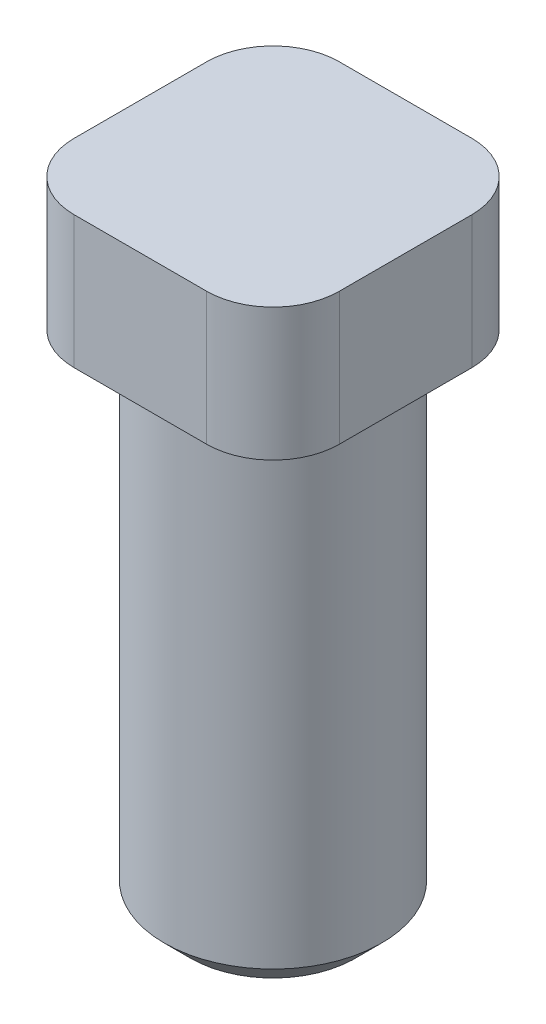
ISO-10303-21;
HEADER;
FILE_DESCRIPTION(('STEP AP214'),'2;1');
FILE_NAME('part.step','',(''),(''),'','','');
FILE_SCHEMA(('AUTOMOTIVE_DESIGN { 1 0 10303 214 1 1 1 1 }'));
ENDSEC;
DATA;
#1=APPLICATION_CONTEXT('core data for automotive mechanical design processes');
#2=APPLICATION_PROTOCOL_DEFINITION('international standard','automotive_design',2000,#1);
#3=PRODUCT_CONTEXT('',#1,'mechanical');
#4=PRODUCT('Part','Part','',(#3));
#5=PRODUCT_RELATED_PRODUCT_CATEGORY('part','',(#4));
#6=PRODUCT_DEFINITION_FORMATION('','',#4);
#7=PRODUCT_DEFINITION_CONTEXT('part definition',#1,'design');
#8=PRODUCT_DEFINITION('design','',#6,#7);
#9=PRODUCT_DEFINITION_SHAPE('','',#8);
#10=(LENGTH_UNIT() NAMED_UNIT(*) SI_UNIT(.MILLI.,.METRE.));
#11=(NAMED_UNIT(*) PLANE_ANGLE_UNIT() SI_UNIT($,.RADIAN.));
#12=(NAMED_UNIT(*) SI_UNIT($,.STERADIAN.) SOLID_ANGLE_UNIT());
#13=UNCERTAINTY_MEASURE_WITH_UNIT(LENGTH_MEASURE(1.E-05),#10,'distance_accuracy_value','');
#14=(GEOMETRIC_REPRESENTATION_CONTEXT(3) GLOBAL_UNCERTAINTY_ASSIGNED_CONTEXT((#13)) GLOBAL_UNIT_ASSIGNED_CONTEXT((#10,
#11,#12)) REPRESENTATION_CONTEXT('',''));
#15=CARTESIAN_POINT('',(0.,0.,0.));
#16=DIRECTION('',(0.,0.,1.));
#17=DIRECTION('',(1.,0.,0.));
#18=AXIS2_PLACEMENT_3D('',#15,#16,#17);
#19=CARTESIAN_POINT('',(0.,19.,0.));
#20=DIRECTION('',(0.,-1.,0.));
#21=DIRECTION('',(0.,0.,-1.));
#22=AXIS2_PLACEMENT_3D('',#19,#20,#21);
#23=CYLINDRICAL_SURFACE('',#22,4.1);
#24=CARTESIAN_POINT('',(0.,1.,0.));
#25=DIRECTION('',(0.,1.,0.));
#26=DIRECTION('',(0.,0.,1.));
#27=AXIS2_PLACEMENT_3D('',#24,#25,#26);
#28=CIRCLE('',#27,4.1);
#29=CARTESIAN_POINT('',(0.,1.,4.1));
#30=VERTEX_POINT('',#29);
#31=EDGE_CURVE('E56',#30,#30,#28,.T.);
#32=ORIENTED_EDGE('',*,*,#31,.T.);
#33=EDGE_LOOP('',(#32));
#34=FACE_BOUND('',#33,.T.);
#35=CARTESIAN_POINT('',(0.,19.,0.));
#36=DIRECTION('',(0.,1.,0.));
#37=DIRECTION('',(0.,0.,1.));
#38=AXIS2_PLACEMENT_3D('',#35,#36,#37);
#39=CIRCLE('',#38,4.1);
#40=CARTESIAN_POINT('',(0.,19.,4.1));
#41=VERTEX_POINT('',#40);
#42=EDGE_CURVE('E149',#41,#41,#39,.T.);
#43=ORIENTED_EDGE('',*,*,#42,.F.);
#44=EDGE_LOOP('',(#43));
#45=FACE_BOUND('',#44,.T.);
#46=ADVANCED_FACE('F47',(#34,#45),#23,.T.);
#47=CARTESIAN_POINT('',(0.,0.,0.));
#48=DIRECTION('',(0.,1.,0.));
#49=DIRECTION('',(0.,0.,1.));
#50=AXIS2_PLACEMENT_3D('',#47,#48,#49);
#51=PLANE('',#50);
#52=CARTESIAN_POINT('',(0.,0.,0.));
#53=DIRECTION('',(0.,1.,0.));
#54=DIRECTION('',(0.,0.,1.));
#55=AXIS2_PLACEMENT_3D('',#52,#53,#54);
#56=CIRCLE('',#55,3.09999999999999);
#57=CARTESIAN_POINT('',(0.,0.,3.09999999999999));
#58=VERTEX_POINT('',#57);
#59=EDGE_CURVE('E11',#58,#58,#56,.F.);
#60=ORIENTED_EDGE('',*,*,#59,.T.);
#61=EDGE_LOOP('',(#60));
#62=FACE_BOUND('',#61,.T.);
#63=ADVANCED_FACE('F192',(#62),#51,.F.);
#64=CARTESIAN_POINT('',(5.,24.,5.));
#65=DIRECTION('',(-1.,0.,0.));
#66=DIRECTION('',(0.,0.,1.));
#67=AXIS2_PLACEMENT_3D('',#64,#65,#66);
#68=PLANE('',#67);
#69=DIRECTION('',(0.,0.,-1.));
#70=VECTOR('',#69,1.);
#71=CARTESIAN_POINT('',(5.,19.,5.));
#72=LINE('',#71,#70);
#73=CARTESIAN_POINT('',(5.,19.,2.5));
#74=VERTEX_POINT('',#73);
#75=CARTESIAN_POINT('',(5.,19.,-2.5));
#76=VERTEX_POINT('',#75);
#77=EDGE_CURVE('E145',#74,#76,#72,.T.);
#78=ORIENTED_EDGE('',*,*,#77,.T.);
#79=DIRECTION('',(0.,-1.,0.));
#80=VECTOR('',#79,1.);
#81=CARTESIAN_POINT('',(5.,24.,-2.5));
#82=LINE('',#81,#80);
#83=CARTESIAN_POINT('',(5.,24.,-2.5));
#84=VERTEX_POINT('',#83);
#85=EDGE_CURVE('E171',#76,#84,#82,.F.);
#86=ORIENTED_EDGE('',*,*,#85,.T.);
#87=DIRECTION('',(0.,0.,-1.));
#88=VECTOR('',#87,1.);
#89=CARTESIAN_POINT('',(5.,24.,5.));
#90=LINE('',#89,#88);
#91=CARTESIAN_POINT('',(5.,24.,2.5));
#92=VERTEX_POINT('',#91);
#93=EDGE_CURVE('E143',#92,#84,#90,.T.);
#94=ORIENTED_EDGE('',*,*,#93,.F.);
#95=DIRECTION('',(0.,-1.,0.));
#96=VECTOR('',#95,1.);
#97=CARTESIAN_POINT('',(5.,24.,2.5));
#98=LINE('',#97,#96);
#99=EDGE_CURVE('E168',#92,#74,#98,.T.);
#100=ORIENTED_EDGE('',*,*,#99,.T.);
#101=EDGE_LOOP('',(#78,#86,#94,#100));
#102=FACE_BOUND('',#101,.T.);
#103=ADVANCED_FACE('F196',(#102),#68,.F.);
#104=CARTESIAN_POINT('',(-5.,24.,-5.));
#105=DIRECTION('',(0.,0.,1.));
#106=DIRECTION('',(1.,0.,0.));
#107=AXIS2_PLACEMENT_3D('',#104,#105,#106);
#108=PLANE('',#107);
#109=DIRECTION('',(-1.,0.,0.));
#110=VECTOR('',#109,1.);
#111=CARTESIAN_POINT('',(-5.,19.,-5.));
#112=LINE('',#111,#110);
#113=CARTESIAN_POINT('',(2.5,19.,-5.));
#114=VERTEX_POINT('',#113);
#115=CARTESIAN_POINT('',(-2.5,19.,-5.));
#116=VERTEX_POINT('',#115);
#117=EDGE_CURVE('E141',#114,#116,#112,.T.);
#118=ORIENTED_EDGE('',*,*,#117,.T.);
#119=DIRECTION('',(0.,-1.,0.));
#120=VECTOR('',#119,1.);
#121=CARTESIAN_POINT('',(-2.5,24.,-5.));
#122=LINE('',#121,#120);
#123=CARTESIAN_POINT('',(-2.5,24.,-5.));
#124=VERTEX_POINT('',#123);
#125=EDGE_CURVE('E120',#116,#124,#122,.F.);
#126=ORIENTED_EDGE('',*,*,#125,.T.);
#127=DIRECTION('',(-1.,0.,0.));
#128=VECTOR('',#127,1.);
#129=CARTESIAN_POINT('',(-5.,24.,-5.));
#130=LINE('',#129,#128);
#131=CARTESIAN_POINT('',(2.5,24.,-5.));
#132=VERTEX_POINT('',#131);
#133=EDGE_CURVE('E222',#132,#124,#130,.T.);
#134=ORIENTED_EDGE('',*,*,#133,.F.);
#135=DIRECTION('',(0.,-1.,0.));
#136=VECTOR('',#135,1.);
#137=CARTESIAN_POINT('',(2.5,24.,-5.));
#138=LINE('',#137,#136);
#139=EDGE_CURVE('E125',#132,#114,#138,.T.);
#140=ORIENTED_EDGE('',*,*,#139,.T.);
#141=EDGE_LOOP('',(#118,#126,#134,#140));
#142=FACE_BOUND('',#141,.T.);
#143=ADVANCED_FACE('F230',(#142),#108,.F.);
#144=CARTESIAN_POINT('',(-5.,24.,5.));
#145=DIRECTION('',(1.,0.,0.));
#146=DIRECTION('',(0.,0.,-1.));
#147=AXIS2_PLACEMENT_3D('',#144,#145,#146);
#148=PLANE('',#147);
#149=DIRECTION('',(0.,0.,1.));
#150=VECTOR('',#149,1.);
#151=CARTESIAN_POINT('',(-5.,24.,5.));
#152=LINE('',#151,#150);
#153=CARTESIAN_POINT('',(-5.,24.,-2.5));
#154=VERTEX_POINT('',#153);
#155=CARTESIAN_POINT('',(-5.,24.,2.5));
#156=VERTEX_POINT('',#155);
#157=EDGE_CURVE('E134',#154,#156,#152,.T.);
#158=ORIENTED_EDGE('',*,*,#157,.F.);
#159=DIRECTION('',(0.,-1.,0.));
#160=VECTOR('',#159,1.);
#161=CARTESIAN_POINT('',(-5.,24.,-2.5));
#162=LINE('',#161,#160);
#163=CARTESIAN_POINT('',(-5.,19.,-2.5));
#164=VERTEX_POINT('',#163);
#165=EDGE_CURVE('E119',#154,#164,#162,.T.);
#166=ORIENTED_EDGE('',*,*,#165,.T.);
#167=DIRECTION('',(0.,0.,1.));
#168=VECTOR('',#167,1.);
#169=CARTESIAN_POINT('',(-5.,19.,5.));
#170=LINE('',#169,#168);
#171=CARTESIAN_POINT('',(-5.,19.,2.5));
#172=VERTEX_POINT('',#171);
#173=EDGE_CURVE('E132',#164,#172,#170,.T.);
#174=ORIENTED_EDGE('',*,*,#173,.T.);
#175=DIRECTION('',(0.,-1.,0.));
#176=VECTOR('',#175,1.);
#177=CARTESIAN_POINT('',(-5.,24.,2.5));
#178=LINE('',#177,#176);
#179=EDGE_CURVE('E136',#172,#156,#178,.F.);
#180=ORIENTED_EDGE('',*,*,#179,.T.);
#181=EDGE_LOOP('',(#158,#166,#174,#180));
#182=FACE_BOUND('',#181,.T.);
#183=ADVANCED_FACE('F131',(#182),#148,.F.);
#184=CARTESIAN_POINT('',(-5.,24.,5.));
#185=DIRECTION('',(0.,0.,-1.));
#186=DIRECTION('',(-1.,0.,0.));
#187=AXIS2_PLACEMENT_3D('',#184,#185,#186);
#188=PLANE('',#187);
#189=DIRECTION('',(1.,0.,0.));
#190=VECTOR('',#189,1.);
#191=CARTESIAN_POINT('',(-5.,19.,5.));
#192=LINE('',#191,#190);
#193=CARTESIAN_POINT('',(-2.5,19.,5.));
#194=VERTEX_POINT('',#193);
#195=CARTESIAN_POINT('',(2.5,19.,5.));
#196=VERTEX_POINT('',#195);
#197=EDGE_CURVE('E140',#194,#196,#192,.T.);
#198=ORIENTED_EDGE('',*,*,#197,.T.);
#199=DIRECTION('',(0.,-1.,0.));
#200=VECTOR('',#199,1.);
#201=CARTESIAN_POINT('',(2.5,24.,5.));
#202=LINE('',#201,#200);
#203=CARTESIAN_POINT('',(2.5,24.,5.));
#204=VERTEX_POINT('',#203);
#205=EDGE_CURVE('E63',#196,#204,#202,.F.);
#206=ORIENTED_EDGE('',*,*,#205,.T.);
#207=DIRECTION('',(1.,0.,0.));
#208=VECTOR('',#207,1.);
#209=CARTESIAN_POINT('',(-5.,24.,5.));
#210=LINE('',#209,#208);
#211=CARTESIAN_POINT('',(-2.5,24.,5.));
#212=VERTEX_POINT('',#211);
#213=EDGE_CURVE('E152',#212,#204,#210,.T.);
#214=ORIENTED_EDGE('',*,*,#213,.F.);
#215=DIRECTION('',(0.,-1.,0.));
#216=VECTOR('',#215,1.);
#217=CARTESIAN_POINT('',(-2.5,24.,5.));
#218=LINE('',#217,#216);
#219=EDGE_CURVE('E173',#212,#194,#218,.T.);
#220=ORIENTED_EDGE('',*,*,#219,.T.);
#221=EDGE_LOOP('',(#198,#206,#214,#220));
#222=FACE_BOUND('',#221,.T.);
#223=ADVANCED_FACE('F237',(#222),#188,.F.);
#224=CARTESIAN_POINT('',(0.,24.,0.));
#225=DIRECTION('',(0.,-1.,0.));
#226=DIRECTION('',(0.,0.,-1.));
#227=AXIS2_PLACEMENT_3D('',#224,#225,#226);
#228=PLANE('',#227);
#229=ORIENTED_EDGE('',*,*,#133,.T.);
#230=CARTESIAN_POINT('',(-2.5,24.,-2.5));
#231=DIRECTION('',(0.,-1.,0.));
#232=DIRECTION('',(0.,0.,-1.));
#233=AXIS2_PLACEMENT_3D('',#230,#231,#232);
#234=CIRCLE('',#233,2.5);
#235=EDGE_CURVE('E166',#124,#154,#234,.F.);
#236=ORIENTED_EDGE('',*,*,#235,.T.);
#237=ORIENTED_EDGE('',*,*,#157,.T.);
#238=CARTESIAN_POINT('',(-2.5,24.,2.5));
#239=DIRECTION('',(0.,-1.,0.));
#240=DIRECTION('',(0.,0.,-1.));
#241=AXIS2_PLACEMENT_3D('',#238,#239,#240);
#242=CIRCLE('',#241,2.5);
#243=EDGE_CURVE('E70',#156,#212,#242,.F.);
#244=ORIENTED_EDGE('',*,*,#243,.T.);
#245=ORIENTED_EDGE('',*,*,#213,.T.);
#246=CARTESIAN_POINT('',(2.5,24.,2.5));
#247=DIRECTION('',(0.,-1.,0.));
#248=DIRECTION('',(0.,0.,-1.));
#249=AXIS2_PLACEMENT_3D('',#246,#247,#248);
#250=CIRCLE('',#249,2.5);
#251=EDGE_CURVE('E162',#204,#92,#250,.F.);
#252=ORIENTED_EDGE('',*,*,#251,.T.);
#253=ORIENTED_EDGE('',*,*,#93,.T.);
#254=CARTESIAN_POINT('',(2.5,24.,-2.5));
#255=DIRECTION('',(0.,-1.,0.));
#256=DIRECTION('',(0.,0.,-1.));
#257=AXIS2_PLACEMENT_3D('',#254,#255,#256);
#258=CIRCLE('',#257,2.5);
#259=EDGE_CURVE('E164',#84,#132,#258,.F.);
#260=ORIENTED_EDGE('',*,*,#259,.T.);
#261=EDGE_LOOP('',(#229,#236,#237,#244,#245,#252,#253,#260));
#262=FACE_BOUND('',#261,.T.);
#263=ADVANCED_FACE('F216',(#262),#228,.F.);
#264=CARTESIAN_POINT('',(0.,19.,0.));
#265=DIRECTION('',(0.,-1.,0.));
#266=DIRECTION('',(0.,0.,-1.));
#267=AXIS2_PLACEMENT_3D('',#264,#265,#266);
#268=PLANE('',#267);
#269=ORIENTED_EDGE('',*,*,#42,.T.);
#270=EDGE_LOOP('',(#269));
#271=FACE_BOUND('',#270,.T.);
#272=ORIENTED_EDGE('',*,*,#173,.F.);
#273=CARTESIAN_POINT('',(-2.5,19.,-2.5));
#274=DIRECTION('',(0.,-1.,0.));
#275=DIRECTION('',(0.,0.,-1.));
#276=AXIS2_PLACEMENT_3D('',#273,#274,#275);
#277=CIRCLE('',#276,2.5);
#278=EDGE_CURVE('E115',#164,#116,#277,.T.);
#279=ORIENTED_EDGE('',*,*,#278,.T.);
#280=ORIENTED_EDGE('',*,*,#117,.F.);
#281=CARTESIAN_POINT('',(2.5,19.,-2.5));
#282=DIRECTION('',(0.,-1.,0.));
#283=DIRECTION('',(0.,0.,-1.));
#284=AXIS2_PLACEMENT_3D('',#281,#282,#283);
#285=CIRCLE('',#284,2.5);
#286=EDGE_CURVE('E126',#114,#76,#285,.T.);
#287=ORIENTED_EDGE('',*,*,#286,.T.);
#288=ORIENTED_EDGE('',*,*,#77,.F.);
#289=CARTESIAN_POINT('',(2.5,19.,2.5));
#290=DIRECTION('',(0.,-1.,0.));
#291=DIRECTION('',(0.,0.,-1.));
#292=AXIS2_PLACEMENT_3D('',#289,#290,#291);
#293=CIRCLE('',#292,2.5);
#294=EDGE_CURVE('E155',#74,#196,#293,.T.);
#295=ORIENTED_EDGE('',*,*,#294,.T.);
#296=ORIENTED_EDGE('',*,*,#197,.F.);
#297=CARTESIAN_POINT('',(-2.5,19.,2.5));
#298=DIRECTION('',(0.,-1.,0.));
#299=DIRECTION('',(0.,0.,-1.));
#300=AXIS2_PLACEMENT_3D('',#297,#298,#299);
#301=CIRCLE('',#300,2.5);
#302=EDGE_CURVE('E135',#194,#172,#301,.T.);
#303=ORIENTED_EDGE('',*,*,#302,.T.);
#304=EDGE_LOOP('',(#272,#279,#280,#287,#288,#295,#296,#303));
#305=FACE_BOUND('',#304,.T.);
#306=ADVANCED_FACE('F138',(#271,#305),#268,.T.);
#307=CARTESIAN_POINT('',(-2.5,24.,-2.5));
#308=DIRECTION('',(0.,-1.,0.));
#309=DIRECTION('',(0.,0.,-1.));
#310=AXIS2_PLACEMENT_3D('',#307,#308,#309);
#311=CYLINDRICAL_SURFACE('',#310,2.5);
#312=ORIENTED_EDGE('',*,*,#235,.F.);
#313=ORIENTED_EDGE('',*,*,#125,.F.);
#314=ORIENTED_EDGE('',*,*,#278,.F.);
#315=ORIENTED_EDGE('',*,*,#165,.F.);
#316=EDGE_LOOP('',(#312,#313,#314,#315));
#317=FACE_BOUND('',#316,.T.);
#318=ADVANCED_FACE('F118',(#317),#311,.T.);
#319=CARTESIAN_POINT('',(2.5,24.,-2.5));
#320=DIRECTION('',(0.,-1.,0.));
#321=DIRECTION('',(0.,0.,-1.));
#322=AXIS2_PLACEMENT_3D('',#319,#320,#321);
#323=CYLINDRICAL_SURFACE('',#322,2.5);
#324=ORIENTED_EDGE('',*,*,#259,.F.);
#325=ORIENTED_EDGE('',*,*,#85,.F.);
#326=ORIENTED_EDGE('',*,*,#286,.F.);
#327=ORIENTED_EDGE('',*,*,#139,.F.);
#328=EDGE_LOOP('',(#324,#325,#326,#327));
#329=FACE_BOUND('',#328,.T.);
#330=ADVANCED_FACE('F203',(#329),#323,.T.);
#331=CARTESIAN_POINT('',(2.5,24.,2.5));
#332=DIRECTION('',(0.,-1.,0.));
#333=DIRECTION('',(0.,0.,-1.));
#334=AXIS2_PLACEMENT_3D('',#331,#332,#333);
#335=CYLINDRICAL_SURFACE('',#334,2.5);
#336=ORIENTED_EDGE('',*,*,#251,.F.);
#337=ORIENTED_EDGE('',*,*,#205,.F.);
#338=ORIENTED_EDGE('',*,*,#294,.F.);
#339=ORIENTED_EDGE('',*,*,#99,.F.);
#340=EDGE_LOOP('',(#336,#337,#338,#339));
#341=FACE_BOUND('',#340,.T.);
#342=ADVANCED_FACE('F188',(#341),#335,.T.);
#343=CARTESIAN_POINT('',(-2.5,24.,2.5));
#344=DIRECTION('',(0.,-1.,0.));
#345=DIRECTION('',(0.,0.,-1.));
#346=AXIS2_PLACEMENT_3D('',#343,#344,#345);
#347=CYLINDRICAL_SURFACE('',#346,2.5);
#348=ORIENTED_EDGE('',*,*,#243,.F.);
#349=ORIENTED_EDGE('',*,*,#179,.F.);
#350=ORIENTED_EDGE('',*,*,#302,.F.);
#351=ORIENTED_EDGE('',*,*,#219,.F.);
#352=EDGE_LOOP('',(#348,#349,#350,#351));
#353=FACE_BOUND('',#352,.T.);
#354=ADVANCED_FACE('F182',(#353),#347,.T.);
#355=CARTESIAN_POINT('',(0.,1.,0.));
#356=DIRECTION('',(0.,1.,0.));
#357=DIRECTION('',(0.,0.,1.));
#358=AXIS2_PLACEMENT_3D('',#355,#356,#357);
#359=CONICAL_SURFACE('',#358,4.1,0.78539816339745);
#360=ORIENTED_EDGE('',*,*,#59,.F.);
#361=EDGE_LOOP('',(#360));
#362=FACE_BOUND('',#361,.T.);
#363=ORIENTED_EDGE('',*,*,#31,.F.);
#364=EDGE_LOOP('',(#363));
#365=FACE_BOUND('',#364,.T.);
#366=ADVANCED_FACE('F50',(#362,#365),#359,.T.);
#367=CLOSED_SHELL('',(#46,#63,#103,#143,#183,#223,#263,#306,#318,#330,#342,#354,#366));
#368=MANIFOLD_SOLID_BREP('B2',#367);
#369=ADVANCED_BREP_SHAPE_REPRESENTATION('',(#18,#368),#14);
#370=SHAPE_DEFINITION_REPRESENTATION(#9,#369);
ENDSEC;
END-ISO-10303-21;
